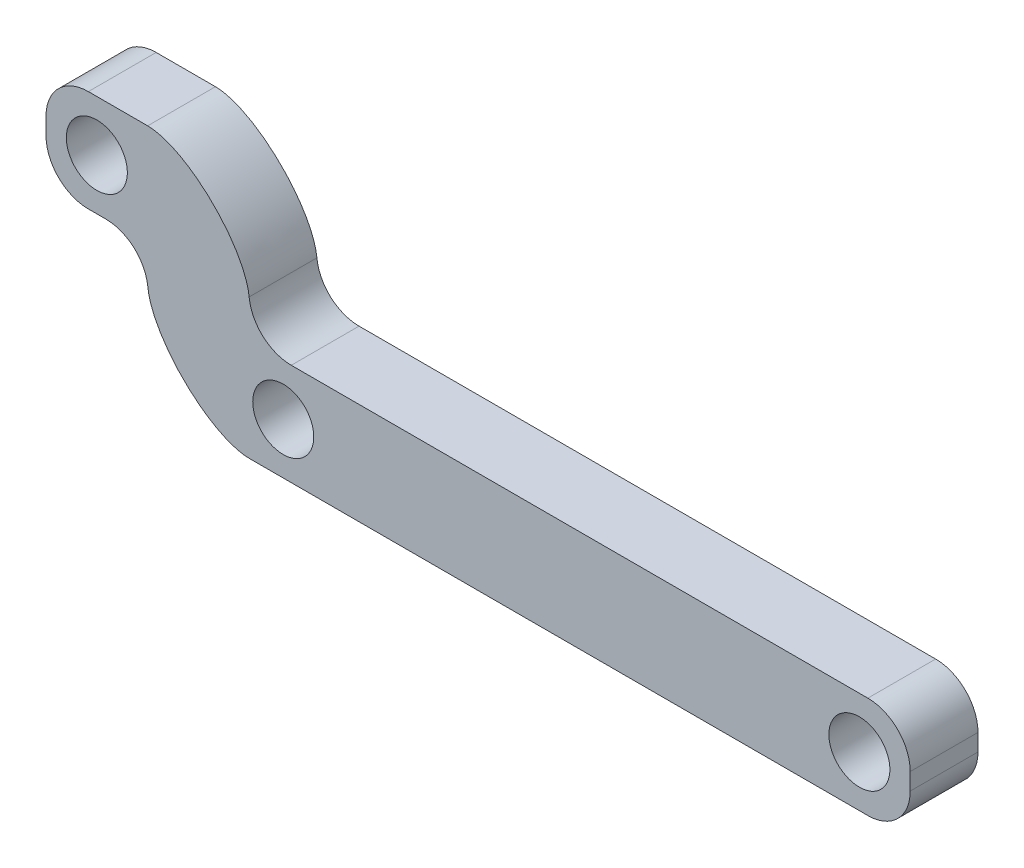
ISO-10303-21;
HEADER;
FILE_DESCRIPTION(('STEP AP214'),'2;1');
FILE_NAME('part.step','',(''),(''),'','','');
FILE_SCHEMA(('AUTOMOTIVE_DESIGN { 1 0 10303 214 1 1 1 1 }'));
ENDSEC;
DATA;
#1=APPLICATION_CONTEXT('core data for automotive mechanical design processes');
#2=APPLICATION_PROTOCOL_DEFINITION('international standard','automotive_design',2000,#1);
#3=PRODUCT_CONTEXT('',#1,'mechanical');
#4=PRODUCT('Part','Part','',(#3));
#5=PRODUCT_RELATED_PRODUCT_CATEGORY('part','',(#4));
#6=PRODUCT_DEFINITION_FORMATION('','',#4);
#7=PRODUCT_DEFINITION_CONTEXT('part definition',#1,'design');
#8=PRODUCT_DEFINITION('design','',#6,#7);
#9=PRODUCT_DEFINITION_SHAPE('','',#8);
#10=(LENGTH_UNIT() NAMED_UNIT(*) SI_UNIT(.MILLI.,.METRE.));
#11=(NAMED_UNIT(*) PLANE_ANGLE_UNIT() SI_UNIT($,.RADIAN.));
#12=(NAMED_UNIT(*) SI_UNIT($,.STERADIAN.) SOLID_ANGLE_UNIT());
#13=UNCERTAINTY_MEASURE_WITH_UNIT(LENGTH_MEASURE(1.E-05),#10,'distance_accuracy_value','');
#14=(GEOMETRIC_REPRESENTATION_CONTEXT(3) GLOBAL_UNCERTAINTY_ASSIGNED_CONTEXT((#13)) GLOBAL_UNIT_ASSIGNED_CONTEXT((#10,
#11,#12)) REPRESENTATION_CONTEXT('',''));
#15=CARTESIAN_POINT('',(0.,0.,0.));
#16=DIRECTION('',(0.,0.,1.));
#17=DIRECTION('',(1.,0.,0.));
#18=AXIS2_PLACEMENT_3D('',#15,#16,#17);
#19=CARTESIAN_POINT('',(0.,0.,4.));
#20=DIRECTION('',(0.,-1.,0.));
#21=DIRECTION('',(1.,0.,0.));
#22=AXIS2_PLACEMENT_3D('',#19,#20,#21);
#23=PLANE('',#22);
#24=DIRECTION('',(-1.,0.,0.));
#25=VECTOR('',#24,1.);
#26=CARTESIAN_POINT('',(0.,0.,0.));
#27=LINE('',#26,#25);
#28=CARTESIAN_POINT('',(-2.5,0.,0.));
#29=VERTEX_POINT('',#28);
#30=CARTESIAN_POINT('',(-36.5257940578732,0.,0.));
#31=VERTEX_POINT('',#30);
#32=EDGE_CURVE('E155',#29,#31,#27,.T.);
#33=ORIENTED_EDGE('',*,*,#32,.T.);
#34=DIRECTION('',(0.,0.,1.));
#35=VECTOR('',#34,1.);
#36=CARTESIAN_POINT('',(-36.5257940578732,0.,4.));
#37=LINE('',#36,#35);
#38=CARTESIAN_POINT('',(-36.5257940578732,0.,4.));
#39=VERTEX_POINT('',#38);
#40=EDGE_CURVE('E57',#31,#39,#37,.T.);
#41=ORIENTED_EDGE('',*,*,#40,.T.);
#42=DIRECTION('',(-1.,0.,0.));
#43=VECTOR('',#42,1.);
#44=CARTESIAN_POINT('',(0.,0.,4.));
#45=LINE('',#44,#43);
#46=CARTESIAN_POINT('',(-2.5,0.,4.));
#47=VERTEX_POINT('',#46);
#48=EDGE_CURVE('E320',#47,#39,#45,.T.);
#49=ORIENTED_EDGE('',*,*,#48,.F.);
#50=DIRECTION('',(0.,0.,-1.));
#51=VECTOR('',#50,1.);
#52=CARTESIAN_POINT('',(-2.5,0.,0.));
#53=LINE('',#52,#51);
#54=EDGE_CURVE('E323',#47,#29,#53,.T.);
#55=ORIENTED_EDGE('',*,*,#54,.T.);
#56=EDGE_LOOP('',(#33,#41,#49,#55));
#57=FACE_BOUND('',#56,.T.);
#58=ADVANCED_FACE('F41',(#57),#23,.F.);
#59=CARTESIAN_POINT('',(0.,7.99999999999999,4.));
#60=DIRECTION('',(0.,1.,0.));
#61=DIRECTION('',(0.,0.,1.));
#62=AXIS2_PLACEMENT_3D('',#59,#60,#61);
#63=PLANE('',#62);
#64=DIRECTION('',(1.,0.,0.));
#65=VECTOR('',#64,1.);
#66=CARTESIAN_POINT('',(0.,7.99999999999999,0.));
#67=LINE('',#66,#65);
#68=CARTESIAN_POINT('',(-48.5,7.99999999999999,0.));
#69=VERTEX_POINT('',#68);
#70=CARTESIAN_POINT('',(-45.,7.99999999999999,0.));
#71=VERTEX_POINT('',#70);
#72=EDGE_CURVE('E144',#69,#71,#67,.T.);
#73=ORIENTED_EDGE('',*,*,#72,.F.);
#74=DIRECTION('',(0.,0.,-1.));
#75=VECTOR('',#74,1.);
#76=CARTESIAN_POINT('',(-48.5,7.99999999999999,4.));
#77=LINE('',#76,#75);
#78=CARTESIAN_POINT('',(-48.5,7.99999999999999,4.));
#79=VERTEX_POINT('',#78);
#80=EDGE_CURVE('E410',#69,#79,#77,.F.);
#81=ORIENTED_EDGE('',*,*,#80,.T.);
#82=DIRECTION('',(1.,0.,0.));
#83=VECTOR('',#82,1.);
#84=CARTESIAN_POINT('',(0.,7.99999999999999,4.));
#85=LINE('',#84,#83);
#86=CARTESIAN_POINT('',(-45.,7.99999999999999,4.));
#87=VERTEX_POINT('',#86);
#88=EDGE_CURVE('E175',#79,#87,#85,.T.);
#89=ORIENTED_EDGE('',*,*,#88,.T.);
#90=CARTESIAN_POINT('',(-45.,7.99999999999999,-0.2));
#91=CARTESIAN_POINT('',(-45.,7.99999999999999,1.26666666666667));
#92=CARTESIAN_POINT('',(-45.,7.99999999999999,2.73333333333333));
#93=CARTESIAN_POINT('',(-45.,7.99999999999999,4.2));
#94=(BOUNDED_CURVE() B_SPLINE_CURVE(3,(#90,#91,#92,#93),.UNSPECIFIED.,.F.,
.F.) B_SPLINE_CURVE_WITH_KNOTS((4,4),(-0.0042,0.0002),
.UNSPECIFIED.) CURVE() GEOMETRIC_REPRESENTATION_ITEM() RATIONAL_B_SPLINE_CURVE((1.,1.,1.,1.)) REPRESENTATION_ITEM(''));
#95=EDGE_CURVE('E163',#87,#71,#94,.F.);
#96=ORIENTED_EDGE('',*,*,#95,.T.);
#97=EDGE_LOOP('',(#73,#81,#89,#96));
#98=FACE_BOUND('',#97,.T.);
#99=ADVANCED_FACE('F173',(#98),#63,.T.);
#100=CARTESIAN_POINT('',(-51.,0.,4.));
#101=DIRECTION('',(1.,0.,0.));
#102=DIRECTION('',(0.,0.,-1.));
#103=AXIS2_PLACEMENT_3D('',#100,#101,#102);
#104=PLANE('',#103);
#105=DIRECTION('',(0.,-1.,0.));
#106=VECTOR('',#105,1.);
#107=CARTESIAN_POINT('',(-51.,0.,4.));
#108=LINE('',#107,#106);
#109=CARTESIAN_POINT('',(-51.,5.49999999999999,4.));
#110=VERTEX_POINT('',#109);
#111=CARTESIAN_POINT('',(-51.,4.49999999999999,4.));
#112=VERTEX_POINT('',#111);
#113=EDGE_CURVE('E405',#110,#112,#108,.T.);
#114=ORIENTED_EDGE('',*,*,#113,.F.);
#115=DIRECTION('',(0.,0.,-1.));
#116=VECTOR('',#115,1.);
#117=CARTESIAN_POINT('',(-51.,5.49999999999999,0.));
#118=LINE('',#117,#116);
#119=CARTESIAN_POINT('',(-51.,5.49999999999999,0.));
#120=VERTEX_POINT('',#119);
#121=EDGE_CURVE('E316',#110,#120,#118,.T.);
#122=ORIENTED_EDGE('',*,*,#121,.T.);
#123=DIRECTION('',(0.,-1.,0.));
#124=VECTOR('',#123,1.);
#125=CARTESIAN_POINT('',(-51.,0.,0.));
#126=LINE('',#125,#124);
#127=CARTESIAN_POINT('',(-51.,4.49999999999999,0.));
#128=VERTEX_POINT('',#127);
#129=EDGE_CURVE('E154',#120,#128,#126,.T.);
#130=ORIENTED_EDGE('',*,*,#129,.T.);
#131=DIRECTION('',(0.,0.,-1.));
#132=VECTOR('',#131,1.);
#133=CARTESIAN_POINT('',(-51.,4.49999999999999,4.));
#134=LINE('',#133,#132);
#135=EDGE_CURVE('E315',#128,#112,#134,.F.);
#136=ORIENTED_EDGE('',*,*,#135,.T.);
#137=EDGE_LOOP('',(#114,#122,#130,#136));
#138=FACE_BOUND('',#137,.T.);
#139=ADVANCED_FACE('F196',(#138),#104,.F.);
#140=CARTESIAN_POINT('',(0.,2.,4.));
#141=DIRECTION('',(0.,-1.,0.));
#142=DIRECTION('',(1.,0.,0.));
#143=AXIS2_PLACEMENT_3D('',#140,#141,#142);
#144=PLANE('',#143);
#145=DIRECTION('',(-1.,0.,0.));
#146=VECTOR('',#145,1.);
#147=CARTESIAN_POINT('',(0.,2.,4.));
#148=LINE('',#147,#146);
#149=CARTESIAN_POINT('',(-47.4742059421268,1.99999999999999,4.));
#150=VERTEX_POINT('',#149);
#151=CARTESIAN_POINT('',(-48.5,1.99999999999999,4.));
#152=VERTEX_POINT('',#151);
#153=EDGE_CURVE('E403',#150,#152,#148,.T.);
#154=ORIENTED_EDGE('',*,*,#153,.T.);
#155=DIRECTION('',(0.,0.,-1.));
#156=VECTOR('',#155,1.);
#157=CARTESIAN_POINT('',(-48.5,1.99999999999999,0.));
#158=LINE('',#157,#156);
#159=CARTESIAN_POINT('',(-48.5,1.99999999999999,0.));
#160=VERTEX_POINT('',#159);
#161=EDGE_CURVE('E329',#152,#160,#158,.T.);
#162=ORIENTED_EDGE('',*,*,#161,.T.);
#163=DIRECTION('',(-1.,0.,0.));
#164=VECTOR('',#163,1.);
#165=CARTESIAN_POINT('',(0.,2.,0.));
#166=LINE('',#165,#164);
#167=CARTESIAN_POINT('',(-47.4742059421268,1.99999999999999,0.));
#168=VERTEX_POINT('',#167);
#169=EDGE_CURVE('E370',#168,#160,#166,.T.);
#170=ORIENTED_EDGE('',*,*,#169,.F.);
#171=DIRECTION('',(0.,0.,-1.));
#172=VECTOR('',#171,1.);
#173=CARTESIAN_POINT('',(-47.4742059421268,1.99999999999999,4.));
#174=LINE('',#173,#172);
#175=EDGE_CURVE('E394',#168,#150,#174,.F.);
#176=ORIENTED_EDGE('',*,*,#175,.T.);
#177=EDGE_LOOP('',(#154,#162,#170,#176));
#178=FACE_BOUND('',#177,.T.);
#179=ADVANCED_FACE('F298',(#178),#144,.T.);
#180=CARTESIAN_POINT('',(0.,-6.,4.));
#181=DIRECTION('',(0.,-1.,0.));
#182=DIRECTION('',(1.,0.,0.));
#183=AXIS2_PLACEMENT_3D('',#180,#181,#182);
#184=PLANE('',#183);
#185=DIRECTION('',(-1.,0.,0.));
#186=VECTOR('',#185,1.);
#187=CARTESIAN_POINT('',(0.,-6.,0.));
#188=LINE('',#187,#186);
#189=CARTESIAN_POINT('',(-2.5,-6.,0.));
#190=VERTEX_POINT('',#189);
#191=CARTESIAN_POINT('',(-39.,-6.,0.));
#192=VERTEX_POINT('',#191);
#193=EDGE_CURVE('E310',#190,#192,#188,.T.);
#194=ORIENTED_EDGE('',*,*,#193,.F.);
#195=DIRECTION('',(0.,0.,-1.));
#196=VECTOR('',#195,1.);
#197=CARTESIAN_POINT('',(-2.5,-6.,4.));
#198=LINE('',#197,#196);
#199=CARTESIAN_POINT('',(-2.5,-6.,4.));
#200=VERTEX_POINT('',#199);
#201=EDGE_CURVE('E342',#190,#200,#198,.F.);
#202=ORIENTED_EDGE('',*,*,#201,.T.);
#203=DIRECTION('',(-1.,0.,0.));
#204=VECTOR('',#203,1.);
#205=CARTESIAN_POINT('',(0.,-6.,4.));
#206=LINE('',#205,#204);
#207=CARTESIAN_POINT('',(-39.,-6.,4.));
#208=VERTEX_POINT('',#207);
#209=EDGE_CURVE('E312',#200,#208,#206,.T.);
#210=ORIENTED_EDGE('',*,*,#209,.T.);
#211=CARTESIAN_POINT('',(-39.,-6.,-0.2));
#212=CARTESIAN_POINT('',(-39.,-6.,1.26666666666667));
#213=CARTESIAN_POINT('',(-39.,-6.,2.73333333333333));
#214=CARTESIAN_POINT('',(-39.,-6.,4.2));
#215=(BOUNDED_CURVE() B_SPLINE_CURVE(3,(#211,#212,#213,#214),.UNSPECIFIED.,.F.,
.F.) B_SPLINE_CURVE_WITH_KNOTS((4,4),(-0.0042,0.0002),
.UNSPECIFIED.) CURVE() GEOMETRIC_REPRESENTATION_ITEM() RATIONAL_B_SPLINE_CURVE((1.,1.,1.,1.)) REPRESENTATION_ITEM(''));
#216=EDGE_CURVE('E309',#208,#192,#215,.F.);
#217=ORIENTED_EDGE('',*,*,#216,.T.);
#218=EDGE_LOOP('',(#194,#202,#210,#217));
#219=FACE_BOUND('',#218,.T.);
#220=ADVANCED_FACE('F294',(#219),#184,.T.);
#221=CARTESIAN_POINT('',(0.,0.,4.));
#222=DIRECTION('',(1.,0.,0.));
#223=DIRECTION('',(0.,0.,-1.));
#224=AXIS2_PLACEMENT_3D('',#221,#222,#223);
#225=PLANE('',#224);
#226=DIRECTION('',(0.,-1.,0.));
#227=VECTOR('',#226,1.);
#228=CARTESIAN_POINT('',(0.,0.,0.));
#229=LINE('',#228,#227);
#230=CARTESIAN_POINT('',(0.,-2.5,0.));
#231=VERTEX_POINT('',#230);
#232=CARTESIAN_POINT('',(0.,-3.5,0.));
#233=VERTEX_POINT('',#232);
#234=EDGE_CURVE('E179',#231,#233,#229,.T.);
#235=ORIENTED_EDGE('',*,*,#234,.F.);
#236=DIRECTION('',(0.,0.,-1.));
#237=VECTOR('',#236,1.);
#238=CARTESIAN_POINT('',(0.,-2.5,4.));
#239=LINE('',#238,#237);
#240=CARTESIAN_POINT('',(0.,-2.5,4.));
#241=VERTEX_POINT('',#240);
#242=EDGE_CURVE('E340',#231,#241,#239,.F.);
#243=ORIENTED_EDGE('',*,*,#242,.T.);
#244=DIRECTION('',(0.,-1.,0.));
#245=VECTOR('',#244,1.);
#246=CARTESIAN_POINT('',(0.,0.,4.));
#247=LINE('',#246,#245);
#248=CARTESIAN_POINT('',(0.,-3.5,4.));
#249=VERTEX_POINT('',#248);
#250=EDGE_CURVE('E176',#241,#249,#247,.T.);
#251=ORIENTED_EDGE('',*,*,#250,.T.);
#252=DIRECTION('',(0.,0.,-1.));
#253=VECTOR('',#252,1.);
#254=CARTESIAN_POINT('',(0.,-3.5,4.));
#255=LINE('',#254,#253);
#256=EDGE_CURVE('E337',#249,#233,#255,.T.);
#257=ORIENTED_EDGE('',*,*,#256,.T.);
#258=EDGE_LOOP('',(#235,#243,#251,#257));
#259=FACE_BOUND('',#258,.T.);
#260=ADVANCED_FACE('F275',(#259),#225,.T.);
#261=CARTESIAN_POINT('',(0.,0.,4.));
#262=DIRECTION('',(0.,0.,1.));
#263=DIRECTION('',(1.,0.,0.));
#264=AXIS2_PLACEMENT_3D('',#261,#262,#263);
#265=PLANE('',#264);
#266=CARTESIAN_POINT('',(-37.,-3.,4.));
#267=DIRECTION('',(0.,0.,-1.));
#268=DIRECTION('',(-1.,0.,0.));
#269=AXIS2_PLACEMENT_3D('',#266,#267,#268);
#270=CIRCLE('',#269,1.8);
#271=CARTESIAN_POINT('',(-38.8,-3.,4.));
#272=VERTEX_POINT('',#271);
#273=EDGE_CURVE('E420',#272,#272,#270,.T.);
#274=ORIENTED_EDGE('',*,*,#273,.T.);
#275=EDGE_LOOP('',(#274));
#276=FACE_BOUND('',#275,.T.);
#277=CARTESIAN_POINT('',(-48.,4.99999999999999,4.));
#278=DIRECTION('',(0.,0.,-1.));
#279=DIRECTION('',(-1.,0.,0.));
#280=AXIS2_PLACEMENT_3D('',#277,#278,#279);
#281=CIRCLE('',#280,1.8);
#282=CARTESIAN_POINT('',(-49.8,4.99999999999999,4.));
#283=VERTEX_POINT('',#282);
#284=EDGE_CURVE('E425',#283,#283,#281,.T.);
#285=ORIENTED_EDGE('',*,*,#284,.T.);
#286=EDGE_LOOP('',(#285));
#287=FACE_BOUND('',#286,.T.);
#288=CARTESIAN_POINT('',(-3.,-3.,4.));
#289=DIRECTION('',(0.,0.,-1.));
#290=DIRECTION('',(-1.,0.,0.));
#291=AXIS2_PLACEMENT_3D('',#288,#289,#290);
#292=CIRCLE('',#291,1.8);
#293=CARTESIAN_POINT('',(-4.8,-3.,4.));
#294=VERTEX_POINT('',#293);
#295=EDGE_CURVE('E356',#294,#294,#292,.T.);
#296=ORIENTED_EDGE('',*,*,#295,.T.);
#297=EDGE_LOOP('',(#296));
#298=FACE_BOUND('',#297,.T.);
#299=ORIENTED_EDGE('',*,*,#88,.F.);
#300=CARTESIAN_POINT('',(-48.5,5.49999999999999,4.));
#301=DIRECTION('',(0.,0.,1.));
#302=DIRECTION('',(1.,0.,0.));
#303=AXIS2_PLACEMENT_3D('',#300,#301,#302);
#304=CIRCLE('',#303,2.5);
#305=EDGE_CURVE('E392',#79,#110,#304,.T.);
#306=ORIENTED_EDGE('',*,*,#305,.T.);
#307=ORIENTED_EDGE('',*,*,#113,.T.);
#308=CARTESIAN_POINT('',(-48.5,4.49999999999999,4.));
#309=DIRECTION('',(0.,0.,1.));
#310=DIRECTION('',(1.,0.,0.));
#311=AXIS2_PLACEMENT_3D('',#308,#309,#310);
#312=CIRCLE('',#311,2.5);
#313=EDGE_CURVE('E389',#112,#152,#312,.T.);
#314=ORIENTED_EDGE('',*,*,#313,.T.);
#315=ORIENTED_EDGE('',*,*,#153,.F.);
#316=CARTESIAN_POINT('',(-47.4742059421268,-0.500000000000016,4.));
#317=DIRECTION('',(0.,0.,1.));
#318=DIRECTION('',(1.,0.,0.));
#319=AXIS2_PLACEMENT_3D('',#316,#317,#318);
#320=CIRCLE('',#319,2.5);
#321=CARTESIAN_POINT('',(-44.9871427333092,-0.246999308411161,4.));
#322=VERTEX_POINT('',#321);
#323=EDGE_CURVE('E346',#150,#322,#320,.F.);
#324=ORIENTED_EDGE('',*,*,#323,.T.);
#325=CARTESIAN_POINT('',(-39.,-6.,4.));
#326=CARTESIAN_POINT('',(-45.,-6.,4.));
#327=CARTESIAN_POINT('',(-45.,0.,4.));
#328=(BOUNDED_CURVE() B_SPLINE_CURVE(2,(#325,#326,#327),.UNSPECIFIED.,.F.,
.F.) B_SPLINE_CURVE_WITH_KNOTS((3,3),(0.,1.),
.UNSPECIFIED.) CURVE() GEOMETRIC_REPRESENTATION_ITEM() RATIONAL_B_SPLINE_CURVE((1.,
0.428571428571429,1.)) REPRESENTATION_ITEM(''));
#329=EDGE_CURVE('E167',#322,#208,#328,.F.);
#330=ORIENTED_EDGE('',*,*,#329,.T.);
#331=ORIENTED_EDGE('',*,*,#209,.F.);
#332=CARTESIAN_POINT('',(-2.5,-3.5,4.));
#333=DIRECTION('',(0.,0.,1.));
#334=DIRECTION('',(1.,0.,0.));
#335=AXIS2_PLACEMENT_3D('',#332,#333,#334);
#336=CIRCLE('',#335,2.5);
#337=EDGE_CURVE('E396',#200,#249,#336,.T.);
#338=ORIENTED_EDGE('',*,*,#337,.T.);
#339=ORIENTED_EDGE('',*,*,#250,.F.);
#340=CARTESIAN_POINT('',(-2.5,-2.5,4.));
#341=DIRECTION('',(0.,0.,1.));
#342=DIRECTION('',(1.,0.,0.));
#343=AXIS2_PLACEMENT_3D('',#340,#341,#342);
#344=CIRCLE('',#343,2.5);
#345=EDGE_CURVE('E64',#241,#47,#344,.T.);
#346=ORIENTED_EDGE('',*,*,#345,.T.);
#347=ORIENTED_EDGE('',*,*,#48,.T.);
#348=CARTESIAN_POINT('',(-36.5257940578732,2.49999999999999,4.));
#349=DIRECTION('',(0.,0.,1.));
#350=DIRECTION('',(1.,0.,0.));
#351=AXIS2_PLACEMENT_3D('',#348,#349,#350);
#352=CIRCLE('',#351,2.5);
#353=CARTESIAN_POINT('',(-39.0128572666905,2.24699930841117,4.));
#354=VERTEX_POINT('',#353);
#355=EDGE_CURVE('E12',#39,#354,#352,.F.);
#356=ORIENTED_EDGE('',*,*,#355,.T.);
#357=CARTESIAN_POINT('',(-45.,7.99999999999999,4.));
#358=CARTESIAN_POINT('',(-39.,7.99999999999999,4.));
#359=CARTESIAN_POINT('',(-39.,1.99999999999999,4.));
#360=(BOUNDED_CURVE() B_SPLINE_CURVE(2,(#357,#358,#359),.UNSPECIFIED.,.F.,
.F.) B_SPLINE_CURVE_WITH_KNOTS((3,3),(0.,1.),
.UNSPECIFIED.) CURVE() GEOMETRIC_REPRESENTATION_ITEM() RATIONAL_B_SPLINE_CURVE((1.,
0.428571428571429,1.)) REPRESENTATION_ITEM(''));
#361=EDGE_CURVE('E245',#354,#87,#360,.F.);
#362=ORIENTED_EDGE('',*,*,#361,.T.);
#363=EDGE_LOOP('',(#299,#306,#307,#314,#315,#324,#330,#331,#338,#339,#346,#347,#356,#362));
#364=FACE_BOUND('',#363,.T.);
#365=ADVANCED_FACE('F266',(#276,#287,#298,#364),#265,.T.);
#366=CARTESIAN_POINT('',(0.,0.,0.));
#367=DIRECTION('',(0.,0.,1.));
#368=DIRECTION('',(1.,0.,0.));
#369=AXIS2_PLACEMENT_3D('',#366,#367,#368);
#370=PLANE('',#369);
#371=CARTESIAN_POINT('',(-37.,-3.,0.));
#372=DIRECTION('',(0.,0.,-1.));
#373=DIRECTION('',(-1.,0.,0.));
#374=AXIS2_PLACEMENT_3D('',#371,#372,#373);
#375=CIRCLE('',#374,1.8);
#376=CARTESIAN_POINT('',(-38.8,-3.,0.));
#377=VERTEX_POINT('',#376);
#378=EDGE_CURVE('E428',#377,#377,#375,.T.);
#379=ORIENTED_EDGE('',*,*,#378,.F.);
#380=EDGE_LOOP('',(#379));
#381=FACE_BOUND('',#380,.T.);
#382=CARTESIAN_POINT('',(-48.,4.99999999999999,0.));
#383=DIRECTION('',(0.,0.,-1.));
#384=DIRECTION('',(-1.,0.,0.));
#385=AXIS2_PLACEMENT_3D('',#382,#383,#384);
#386=CIRCLE('',#385,1.8);
#387=CARTESIAN_POINT('',(-49.8,4.99999999999999,0.));
#388=VERTEX_POINT('',#387);
#389=EDGE_CURVE('E422',#388,#388,#386,.T.);
#390=ORIENTED_EDGE('',*,*,#389,.F.);
#391=EDGE_LOOP('',(#390));
#392=FACE_BOUND('',#391,.T.);
#393=CARTESIAN_POINT('',(-3.,-3.,0.));
#394=DIRECTION('',(0.,0.,-1.));
#395=DIRECTION('',(-1.,0.,0.));
#396=AXIS2_PLACEMENT_3D('',#393,#394,#395);
#397=CIRCLE('',#396,1.8);
#398=CARTESIAN_POINT('',(-4.8,-3.,0.));
#399=VERTEX_POINT('',#398);
#400=EDGE_CURVE('E359',#399,#399,#397,.T.);
#401=ORIENTED_EDGE('',*,*,#400,.F.);
#402=EDGE_LOOP('',(#401));
#403=FACE_BOUND('',#402,.T.);
#404=ORIENTED_EDGE('',*,*,#129,.F.);
#405=CARTESIAN_POINT('',(-48.5,5.49999999999999,0.));
#406=DIRECTION('',(0.,0.,1.));
#407=DIRECTION('',(1.,0.,0.));
#408=AXIS2_PLACEMENT_3D('',#405,#406,#407);
#409=CIRCLE('',#408,2.5);
#410=EDGE_CURVE('E150',#120,#69,#409,.F.);
#411=ORIENTED_EDGE('',*,*,#410,.T.);
#412=ORIENTED_EDGE('',*,*,#72,.T.);
#413=CARTESIAN_POINT('',(-39.,1.99999999999999,0.));
#414=CARTESIAN_POINT('',(-39.,7.99999999999999,0.));
#415=CARTESIAN_POINT('',(-45.,7.99999999999999,0.));
#416=(BOUNDED_CURVE() B_SPLINE_CURVE(2,(#413,#414,#415),.UNSPECIFIED.,.F.,
.F.) B_SPLINE_CURVE_WITH_KNOTS((3,3),(0.,1.),
.UNSPECIFIED.) CURVE() GEOMETRIC_REPRESENTATION_ITEM() RATIONAL_B_SPLINE_CURVE((1.,
0.428571428571428,1.)) REPRESENTATION_ITEM(''));
#417=CARTESIAN_POINT('',(-39.0128486775161,2.24700014004863,0.));
#418=VERTEX_POINT('',#417);
#419=EDGE_CURVE('E148',#71,#418,#416,.F.);
#420=ORIENTED_EDGE('',*,*,#419,.T.);
#421=CARTESIAN_POINT('',(-36.5257940578732,2.49999999999999,0.));
#422=DIRECTION('',(0.,0.,1.));
#423=DIRECTION('',(1.,0.,0.));
#424=AXIS2_PLACEMENT_3D('',#421,#422,#423);
#425=CIRCLE('',#424,2.5);
#426=EDGE_CURVE('E50',#418,#31,#425,.T.);
#427=ORIENTED_EDGE('',*,*,#426,.T.);
#428=ORIENTED_EDGE('',*,*,#32,.F.);
#429=CARTESIAN_POINT('',(-2.5,-2.5,0.));
#430=DIRECTION('',(0.,0.,1.));
#431=DIRECTION('',(1.,0.,0.));
#432=AXIS2_PLACEMENT_3D('',#429,#430,#431);
#433=CIRCLE('',#432,2.5);
#434=EDGE_CURVE('E608',#29,#231,#433,.F.);
#435=ORIENTED_EDGE('',*,*,#434,.T.);
#436=ORIENTED_EDGE('',*,*,#234,.T.);
#437=CARTESIAN_POINT('',(-2.5,-3.5,0.));
#438=DIRECTION('',(0.,0.,1.));
#439=DIRECTION('',(1.,0.,0.));
#440=AXIS2_PLACEMENT_3D('',#437,#438,#439);
#441=CIRCLE('',#440,2.5);
#442=EDGE_CURVE('E371',#233,#190,#441,.F.);
#443=ORIENTED_EDGE('',*,*,#442,.T.);
#444=ORIENTED_EDGE('',*,*,#193,.T.);
#445=CARTESIAN_POINT('',(-45.,0.,0.));
#446=CARTESIAN_POINT('',(-45.,-6.00000000000001,0.));
#447=CARTESIAN_POINT('',(-39.,-6.,0.));
#448=(BOUNDED_CURVE() B_SPLINE_CURVE(2,(#445,#446,#447),.UNSPECIFIED.,.F.,
.F.) B_SPLINE_CURVE_WITH_KNOTS((3,3),(0.,1.),
.UNSPECIFIED.) CURVE() GEOMETRIC_REPRESENTATION_ITEM() RATIONAL_B_SPLINE_CURVE((1.,
0.428571428571428,1.)) REPRESENTATION_ITEM(''));
#449=CARTESIAN_POINT('',(-44.9871513224833,-0.247000140048601,0.));
#450=VERTEX_POINT('',#449);
#451=EDGE_CURVE('E168',#192,#450,#448,.F.);
#452=ORIENTED_EDGE('',*,*,#451,.T.);
#453=CARTESIAN_POINT('',(-47.4742059421268,-0.500000000000016,0.));
#454=DIRECTION('',(0.,0.,1.));
#455=DIRECTION('',(1.,0.,0.));
#456=AXIS2_PLACEMENT_3D('',#453,#454,#455);
#457=CIRCLE('',#456,2.5);
#458=EDGE_CURVE('E344',#450,#168,#457,.T.);
#459=ORIENTED_EDGE('',*,*,#458,.T.);
#460=ORIENTED_EDGE('',*,*,#169,.T.);
#461=CARTESIAN_POINT('',(-48.5,4.49999999999999,0.));
#462=DIRECTION('',(0.,0.,1.));
#463=DIRECTION('',(1.,0.,0.));
#464=AXIS2_PLACEMENT_3D('',#461,#462,#463);
#465=CIRCLE('',#464,2.5);
#466=EDGE_CURVE('E387',#160,#128,#465,.F.);
#467=ORIENTED_EDGE('',*,*,#466,.T.);
#468=EDGE_LOOP('',(#404,#411,#412,#420,#427,#428,#435,#436,#443,#444,#452,#459,#460,#467));
#469=FACE_BOUND('',#468,.T.);
#470=ADVANCED_FACE('F147',(#381,#392,#403,#469),#370,.F.);
#471=CARTESIAN_POINT('',(-3.,-3.,4.));
#472=DIRECTION('',(0.,0.,-1.));
#473=DIRECTION('',(-1.,0.,0.));
#474=AXIS2_PLACEMENT_3D('',#471,#472,#473);
#475=CYLINDRICAL_SURFACE('',#474,1.8);
#476=ORIENTED_EDGE('',*,*,#295,.F.);
#477=EDGE_LOOP('',(#476));
#478=FACE_BOUND('',#477,.T.);
#479=ORIENTED_EDGE('',*,*,#400,.T.);
#480=EDGE_LOOP('',(#479));
#481=FACE_BOUND('',#480,.T.);
#482=ADVANCED_FACE('F277',(#478,#481),#475,.F.);
#483=CARTESIAN_POINT('',(-48.,4.99999999999999,4.));
#484=DIRECTION('',(0.,0.,-1.));
#485=DIRECTION('',(-1.,0.,0.));
#486=AXIS2_PLACEMENT_3D('',#483,#484,#485);
#487=CYLINDRICAL_SURFACE('',#486,1.8);
#488=ORIENTED_EDGE('',*,*,#284,.F.);
#489=EDGE_LOOP('',(#488));
#490=FACE_BOUND('',#489,.T.);
#491=ORIENTED_EDGE('',*,*,#389,.T.);
#492=EDGE_LOOP('',(#491));
#493=FACE_BOUND('',#492,.T.);
#494=ADVANCED_FACE('F437',(#490,#493),#487,.F.);
#495=CARTESIAN_POINT('',(-37.,-3.,4.));
#496=DIRECTION('',(0.,0.,-1.));
#497=DIRECTION('',(-1.,0.,0.));
#498=AXIS2_PLACEMENT_3D('',#495,#496,#497);
#499=CYLINDRICAL_SURFACE('',#498,1.8);
#500=ORIENTED_EDGE('',*,*,#273,.F.);
#501=EDGE_LOOP('',(#500));
#502=FACE_BOUND('',#501,.T.);
#503=ORIENTED_EDGE('',*,*,#378,.T.);
#504=EDGE_LOOP('',(#503));
#505=FACE_BOUND('',#504,.T.);
#506=ADVANCED_FACE('F209',(#502,#505),#499,.F.);
#507=CARTESIAN_POINT('',(-39.,1.99999999999999,-0.2));
#508=CARTESIAN_POINT('',(-39.,1.99999999999999,1.26666666666667));
#509=CARTESIAN_POINT('',(-39.,1.99999999999999,2.73333333333333));
#510=CARTESIAN_POINT('',(-39.,1.99999999999999,4.2));
#511=CARTESIAN_POINT('',(-39.,7.99999999999999,-0.2));
#512=CARTESIAN_POINT('',(-39.,7.99999999999999,1.26666666666667));
#513=CARTESIAN_POINT('',(-39.,7.99999999999999,2.73333333333333));
#514=CARTESIAN_POINT('',(-39.,7.99999999999999,4.2));
#515=CARTESIAN_POINT('',(-45.,7.99999999999999,-0.2));
#516=CARTESIAN_POINT('',(-45.,7.99999999999999,1.26666666666667));
#517=CARTESIAN_POINT('',(-45.,7.99999999999999,2.73333333333333));
#518=CARTESIAN_POINT('',(-45.,7.99999999999999,4.2));
#519=(BOUNDED_SURFACE() B_SPLINE_SURFACE(2,3,((#507,#508,#509,#510),(#511,#512,#513,#514),(#515,
#516,#517,#518)),.UNSPECIFIED.,.F.,.F.,.F.) B_SPLINE_SURFACE_WITH_KNOTS((3,3),(4,4),(0.,1.),
(-0.0042,0.0002),.UNSPECIFIED.) GEOMETRIC_REPRESENTATION_ITEM() RATIONAL_B_SPLINE_SURFACE(((1.,
1.,1.,1.),(0.428571428571429,0.428571428571429,0.428571428571429,0.428571428571429),(1.,1.,1.,1.))) REPRESENTATION_ITEM('') SURFACE());
#520=DIRECTION('',(0.,0.,1.));
#521=VECTOR('',#520,1.);
#522=CARTESIAN_POINT('',(-39.0129582173361,2.24698924156599,4.));
#523=LINE('',#522,#521);
#524=EDGE_CURVE('E166',#354,#418,#523,.F.);
#525=ORIENTED_EDGE('',*,*,#361,.F.);
#526=ORIENTED_EDGE('',*,*,#524,.T.);
#527=ORIENTED_EDGE('',*,*,#419,.F.);
#528=ORIENTED_EDGE('',*,*,#95,.F.);
#529=EDGE_LOOP('',(#525,#526,#527,#528));
#530=FACE_BOUND('',#529,.T.);
#531=ADVANCED_FACE('F162',(#530),#519,.T.);
#532=CARTESIAN_POINT('',(-45.,0.,-0.2));
#533=CARTESIAN_POINT('',(-45.,0.,1.26666666666667));
#534=CARTESIAN_POINT('',(-45.,0.,2.73333333333333));
#535=CARTESIAN_POINT('',(-45.,0.,4.2));
#536=CARTESIAN_POINT('',(-45.,-6.,-0.2));
#537=CARTESIAN_POINT('',(-45.,-6.,1.26666666666667));
#538=CARTESIAN_POINT('',(-45.,-6.,2.73333333333333));
#539=CARTESIAN_POINT('',(-45.,-6.,4.2));
#540=CARTESIAN_POINT('',(-39.,-6.,-0.2));
#541=CARTESIAN_POINT('',(-39.,-6.,1.26666666666667));
#542=CARTESIAN_POINT('',(-39.,-6.,2.73333333333333));
#543=CARTESIAN_POINT('',(-39.,-6.,4.2));
#544=(BOUNDED_SURFACE() B_SPLINE_SURFACE(2,3,((#532,#533,#534,#535),(#536,#537,#538,#539),(#540,
#541,#542,#543)),.UNSPECIFIED.,.F.,.F.,.F.) B_SPLINE_SURFACE_WITH_KNOTS((3,3),(4,4),(0.,1.),
(-0.0042,0.0002),.UNSPECIFIED.) GEOMETRIC_REPRESENTATION_ITEM() RATIONAL_B_SPLINE_SURFACE(((1.,
1.,1.,1.),(0.428571428571429,0.428571428571429,0.428571428571429,0.428571428571429),(1.,1.,1.,1.))) REPRESENTATION_ITEM('') SURFACE());
#545=DIRECTION('',(0.,0.,1.));
#546=VECTOR('',#545,1.);
#547=CARTESIAN_POINT('',(-44.9870417826639,-0.246989241566014,4.));
#548=LINE('',#547,#546);
#549=EDGE_CURVE('E324',#322,#450,#548,.F.);
#550=ORIENTED_EDGE('',*,*,#329,.F.);
#551=ORIENTED_EDGE('',*,*,#549,.T.);
#552=ORIENTED_EDGE('',*,*,#451,.F.);
#553=ORIENTED_EDGE('',*,*,#216,.F.);
#554=EDGE_LOOP('',(#550,#551,#552,#553));
#555=FACE_BOUND('',#554,.T.);
#556=ADVANCED_FACE('F208',(#555),#544,.T.);
#557=CARTESIAN_POINT('',(-48.5,5.49999999999999,4.));
#558=DIRECTION('',(0.,0.,1.));
#559=DIRECTION('',(1.,0.,0.));
#560=AXIS2_PLACEMENT_3D('',#557,#558,#559);
#561=CYLINDRICAL_SURFACE('',#560,2.5);
#562=ORIENTED_EDGE('',*,*,#305,.F.);
#563=ORIENTED_EDGE('',*,*,#80,.F.);
#564=ORIENTED_EDGE('',*,*,#410,.F.);
#565=ORIENTED_EDGE('',*,*,#121,.F.);
#566=EDGE_LOOP('',(#562,#563,#564,#565));
#567=FACE_BOUND('',#566,.T.);
#568=ADVANCED_FACE('F473',(#567),#561,.T.);
#569=CARTESIAN_POINT('',(-48.5,4.49999999999999,4.));
#570=DIRECTION('',(0.,0.,1.));
#571=DIRECTION('',(1.,0.,0.));
#572=AXIS2_PLACEMENT_3D('',#569,#570,#571);
#573=CYLINDRICAL_SURFACE('',#572,2.5);
#574=ORIENTED_EDGE('',*,*,#313,.F.);
#575=ORIENTED_EDGE('',*,*,#135,.F.);
#576=ORIENTED_EDGE('',*,*,#466,.F.);
#577=ORIENTED_EDGE('',*,*,#161,.F.);
#578=EDGE_LOOP('',(#574,#575,#576,#577));
#579=FACE_BOUND('',#578,.T.);
#580=ADVANCED_FACE('F385',(#579),#573,.T.);
#581=CARTESIAN_POINT('',(-47.4742059421268,-0.500000000000016,2.));
#582=DIRECTION('',(0.,0.,1.));
#583=DIRECTION('',(1.,0.,0.));
#584=AXIS2_PLACEMENT_3D('',#581,#582,#583);
#585=CYLINDRICAL_SURFACE('',#584,2.5);
#586=ORIENTED_EDGE('',*,*,#323,.F.);
#587=ORIENTED_EDGE('',*,*,#175,.F.);
#588=ORIENTED_EDGE('',*,*,#458,.F.);
#589=ORIENTED_EDGE('',*,*,#549,.F.);
#590=EDGE_LOOP('',(#586,#587,#588,#589));
#591=FACE_BOUND('',#590,.T.);
#592=ADVANCED_FACE('F485',(#591),#585,.F.);
#593=CARTESIAN_POINT('',(-36.5257940578732,2.49999999999999,2.));
#594=DIRECTION('',(0.,0.,1.));
#595=DIRECTION('',(1.,0.,0.));
#596=AXIS2_PLACEMENT_3D('',#593,#594,#595);
#597=CYLINDRICAL_SURFACE('',#596,2.5);
#598=ORIENTED_EDGE('',*,*,#355,.F.);
#599=ORIENTED_EDGE('',*,*,#40,.F.);
#600=ORIENTED_EDGE('',*,*,#426,.F.);
#601=ORIENTED_EDGE('',*,*,#524,.F.);
#602=EDGE_LOOP('',(#598,#599,#600,#601));
#603=FACE_BOUND('',#602,.T.);
#604=ADVANCED_FACE('F322',(#603),#597,.F.);
#605=CARTESIAN_POINT('',(-2.5,-2.5,4.));
#606=DIRECTION('',(0.,0.,1.));
#607=DIRECTION('',(1.,0.,0.));
#608=AXIS2_PLACEMENT_3D('',#605,#606,#607);
#609=CYLINDRICAL_SURFACE('',#608,2.5);
#610=ORIENTED_EDGE('',*,*,#345,.F.);
#611=ORIENTED_EDGE('',*,*,#242,.F.);
#612=ORIENTED_EDGE('',*,*,#434,.F.);
#613=ORIENTED_EDGE('',*,*,#54,.F.);
#614=EDGE_LOOP('',(#610,#611,#612,#613));
#615=FACE_BOUND('',#614,.T.);
#616=ADVANCED_FACE('F499',(#615),#609,.T.);
#617=CARTESIAN_POINT('',(-2.5,-3.5,4.));
#618=DIRECTION('',(0.,0.,-1.));
#619=DIRECTION('',(-1.,0.,0.));
#620=AXIS2_PLACEMENT_3D('',#617,#618,#619);
#621=CYLINDRICAL_SURFACE('',#620,2.5);
#622=ORIENTED_EDGE('',*,*,#337,.F.);
#623=ORIENTED_EDGE('',*,*,#201,.F.);
#624=ORIENTED_EDGE('',*,*,#442,.F.);
#625=ORIENTED_EDGE('',*,*,#256,.F.);
#626=EDGE_LOOP('',(#622,#623,#624,#625));
#627=FACE_BOUND('',#626,.T.);
#628=ADVANCED_FACE('F43',(#627),#621,.T.);
#629=CLOSED_SHELL('',(#58,#99,#139,#179,#220,#260,#365,#470,#482,#494,#506,#531,#556,#568,#580,
#592,#604,#616,#628));
#630=MANIFOLD_SOLID_BREP('B2',#629);
#631=ADVANCED_BREP_SHAPE_REPRESENTATION('',(#18,#630),#14);
#632=SHAPE_DEFINITION_REPRESENTATION(#9,#631);
ENDSEC;
END-ISO-10303-21;
